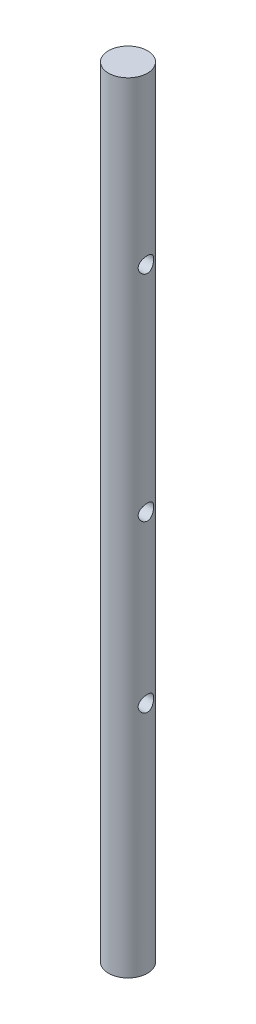
ISO-10303-21;
HEADER;
FILE_DESCRIPTION(('STEP AP214'),'2;1');
FILE_NAME('part.step','',(''),(''),'','','');
FILE_SCHEMA(('AUTOMOTIVE_DESIGN { 1 0 10303 214 1 1 1 1 }'));
ENDSEC;
DATA;
#1=APPLICATION_CONTEXT('core data for automotive mechanical design processes');
#2=APPLICATION_PROTOCOL_DEFINITION('international standard','automotive_design',2000,#1);
#3=PRODUCT_CONTEXT('',#1,'mechanical');
#4=PRODUCT('Part','Part','',(#3));
#5=PRODUCT_RELATED_PRODUCT_CATEGORY('part','',(#4));
#6=PRODUCT_DEFINITION_FORMATION('','',#4);
#7=PRODUCT_DEFINITION_CONTEXT('part definition',#1,'design');
#8=PRODUCT_DEFINITION('design','',#6,#7);
#9=PRODUCT_DEFINITION_SHAPE('','',#8);
#10=(LENGTH_UNIT() NAMED_UNIT(*) SI_UNIT(.MILLI.,.METRE.));
#11=(NAMED_UNIT(*) PLANE_ANGLE_UNIT() SI_UNIT($,.RADIAN.));
#12=(NAMED_UNIT(*) SI_UNIT($,.STERADIAN.) SOLID_ANGLE_UNIT());
#13=UNCERTAINTY_MEASURE_WITH_UNIT(LENGTH_MEASURE(1.E-05),#10,'distance_accuracy_value','');
#14=(GEOMETRIC_REPRESENTATION_CONTEXT(3) GLOBAL_UNCERTAINTY_ASSIGNED_CONTEXT((#13)) GLOBAL_UNIT_ASSIGNED_CONTEXT((#10,
#11,#12)) REPRESENTATION_CONTEXT('',''));
#15=CARTESIAN_POINT('',(0.,0.,0.));
#16=DIRECTION('',(0.,0.,1.));
#17=DIRECTION('',(1.,0.,0.));
#18=AXIS2_PLACEMENT_3D('',#15,#16,#17);
#19=CARTESIAN_POINT('',(0.,40.,0.));
#20=DIRECTION('',(0.,-1.,0.));
#21=DIRECTION('',(0.,0.,-1.));
#22=AXIS2_PLACEMENT_3D('',#19,#20,#21);
#23=CYLINDRICAL_SURFACE('',#22,2.);
#24=CARTESIAN_POINT('',(-1.83574533568794,-15.9999999999999,-0.793749999999993));
#25=CARTESIAN_POINT('',(-1.83574955054247,-15.9574484641707,-0.793745396301787));
#26=CARTESIAN_POINT('',(-1.83724567997836,-15.914835025832,-0.790308000142732));
#27=CARTESIAN_POINT('',(-1.84304379579147,-15.8308287130867,-0.776685731636039));
#28=CARTESIAN_POINT('',(-1.84735301917327,-15.7894392754298,-0.766483454794609));
#29=CARTESIAN_POINT('',(-1.85820609703918,-15.7092378458049,-0.739780682359105));
#30=CARTESIAN_POINT('',(-1.86474160512701,-15.6704168646051,-0.723303684027096));
#31=CARTESIAN_POINT('',(-1.87929924018793,-15.5960995989641,-0.684587700670641));
#32=CARTESIAN_POINT('',(-1.88732102526627,-15.5606025527249,-0.66235004032882));
#33=CARTESIAN_POINT('',(-1.90445306254819,-15.491921939935,-0.611404607877717));
#34=CARTESIAN_POINT('',(-1.91359797135974,-15.458948896379,-0.58242455320319));
#35=CARTESIAN_POINT('',(-1.93165936134538,-15.3981774422812,-0.519390333561787));
#36=CARTESIAN_POINT('',(-1.94057576241782,-15.3703808254656,-0.485334417048486));
#37=CARTESIAN_POINT('',(-1.95759051200044,-15.3197117508262,-0.411494211014499));
#38=CARTESIAN_POINT('',(-1.96564381830241,-15.2970716273891,-0.371539178053825));
#39=CARTESIAN_POINT('',(-1.97960568485495,-15.2589235628622,-0.288010942260691));
#40=CARTESIAN_POINT('',(-1.98551510480408,-15.2434127622461,-0.244439198361519));
#41=CARTESIAN_POINT('',(-1.994278096342,-15.2207127549989,-0.157121125661687));
#42=CARTESIAN_POINT('',(-1.99726409034064,-15.2131616141388,-0.11348244391469));
#43=CARTESIAN_POINT('',(-2.00032198572337,-15.2054305685026,-0.0254620285282214));
#44=CARTESIAN_POINT('',(-2.00039495642489,-15.2052479588735,0.0189194264676442));
#45=CARTESIAN_POINT('',(-1.99769963645173,-15.2120591423197,0.104552158565124));
#46=CARTESIAN_POINT('',(-1.99508827426674,-15.2186565632733,0.14584079325567));
#47=CARTESIAN_POINT('',(-1.98752850107357,-15.2381672870216,0.226669100655476));
#48=CARTESIAN_POINT('',(-1.98257991880232,-15.2510810526577,0.26620864496544));
#49=CARTESIAN_POINT('',(-1.97073664770769,-15.2830171254289,0.343125832511271));
#50=CARTESIAN_POINT('',(-1.96381384179653,-15.3021282789574,0.380462078321979));
#51=CARTESIAN_POINT('',(-1.94871088205107,-15.3458340129062,0.451493621649775));
#52=CARTESIAN_POINT('',(-1.94053030046886,-15.3704304600674,0.48518767385542));
#53=CARTESIAN_POINT('',(-1.92311843114675,-15.4262655701642,0.550294343512175));
#54=CARTESIAN_POINT('',(-1.91385340781356,-15.4578312066733,0.58141795010705));
#55=CARTESIAN_POINT('',(-1.89572727665502,-15.5257725909393,0.638047100725501));
#56=CARTESIAN_POINT('',(-1.88686629759576,-15.5621498579196,0.663550863531981));
#57=CARTESIAN_POINT('',(-1.87032419901317,-15.6399544316078,0.708863105539234));
#58=CARTESIAN_POINT('',(-1.86268211597722,-15.681492901281,0.728496148845984));
#59=CARTESIAN_POINT('',(-1.84989983834642,-15.7676704453951,0.760374307325914));
#60=CARTESIAN_POINT('',(-1.84475804920836,-15.8123075229083,0.772624132286879));
#61=CARTESIAN_POINT('',(-1.83794414914909,-15.9005352392242,0.788690933678145));
#62=CARTESIAN_POINT('',(-1.83608132636498,-15.9440263901334,0.792972324086437));
#63=CARTESIAN_POINT('',(-1.83549335630922,-16.0311361037071,0.794333364515734));
#64=CARTESIAN_POINT('',(-1.83676728049773,-16.0747546248497,0.791415145764527));
#65=CARTESIAN_POINT('',(-1.84211379225481,-16.1583276832494,0.778882445152772));
#66=CARTESIAN_POINT('',(-1.84602654712882,-16.1983509804937,0.76964998649291));
#67=CARTESIAN_POINT('',(-1.8560126925925,-16.2762549417427,0.745244554049858));
#68=CARTESIAN_POINT('',(-1.86208655756813,-16.3141351331959,0.730070275902407));
#69=CARTESIAN_POINT('',(-1.8760094490388,-16.3883748212218,0.693530338384259));
#70=CARTESIAN_POINT('',(-1.88392001116966,-16.4246120063183,0.671940347321197));
#71=CARTESIAN_POINT('',(-1.90052993664314,-16.493112167528,0.62341234280231));
#72=CARTESIAN_POINT('',(-1.90922961650422,-16.5253735365779,0.596472178170032));
#73=CARTESIAN_POINT('',(-1.92719923514798,-16.5874368928383,0.535701976570249));
#74=CARTESIAN_POINT('',(-1.93646478919637,-16.6168909926408,0.501514024585907));
#75=CARTESIAN_POINT('',(-1.95392735928662,-16.6696964777956,0.428458518504622));
#76=CARTESIAN_POINT('',(-1.96212433755802,-16.6930476474596,0.389590799087355));
#77=CARTESIAN_POINT('',(-1.97654765183198,-16.7328882868587,0.308164862923358));
#78=CARTESIAN_POINT('',(-1.98277537108028,-16.749382575574,0.265609263504555));
#79=CARTESIAN_POINT('',(-1.99254765820735,-16.7748711548716,0.178019881177012));
#80=CARTESIAN_POINT('',(-1.99609365688725,-16.7838694451181,0.132987433540315));
#81=CARTESIAN_POINT('',(-1.99995222373459,-16.7936409758111,0.0448486948475377));
#82=CARTESIAN_POINT('',(-2.00045823500524,-16.7949063783654,0.00180500892137128));
#83=CARTESIAN_POINT('',(-1.99870005498365,-16.790471582344,-0.0838596973965634));
#84=CARTESIAN_POINT('',(-1.99643627178576,-16.7847724099108,-0.126480779121098));
#85=CARTESIAN_POINT('',(-1.98948862254071,-16.7669213899222,-0.208786505249207));
#86=CARTESIAN_POINT('',(-1.98487907797685,-16.7549674054179,-0.248520835895962));
#87=CARTESIAN_POINT('',(-1.97373163185118,-16.7251525226997,-0.325414046077396));
#88=CARTESIAN_POINT('',(-1.96719337199144,-16.7072905268781,-0.362572445495235));
#89=CARTESIAN_POINT('',(-1.95247434043231,-16.6652807458812,-0.43505379922015));
#90=CARTESIAN_POINT('',(-1.94423399280796,-16.640891128128,-0.470224229941565));
#91=CARTESIAN_POINT('',(-1.92710578577927,-16.5868824383784,-0.536119806851737));
#92=CARTESIAN_POINT('',(-1.9182176652095,-16.5572612502197,-0.566843145013115));
#93=CARTESIAN_POINT('',(-1.90012595565144,-16.4915035582623,-0.624901494634382));
#94=CARTESIAN_POINT('',(-1.89093599240793,-16.4550806125859,-0.651917387975951));
#95=CARTESIAN_POINT('',(-1.87386670073336,-16.377923328667,-0.699474739933922));
#96=CARTESIAN_POINT('',(-1.86598753485959,-16.3371884567085,-0.720015395812111));
#97=CARTESIAN_POINT('',(-1.85315134716856,-16.2562455103246,-0.752400473276935));
#98=CARTESIAN_POINT('',(-1.84799680147857,-16.2163126103519,-0.76485570592469));
#99=CARTESIAN_POINT('',(-1.84024600746584,-16.1348160503051,-0.783325471994174));
#100=CARTESIAN_POINT('',(-1.8376425956624,-16.0932572992531,-0.789358044135553));
#101=CARTESIAN_POINT('',(-1.83598526376804,-16.0343594102847,-0.793193827235275));
#102=CARTESIAN_POINT('',(-1.83574363348767,-16.0171847533171,-0.793751859237656));
#103=CARTESIAN_POINT('',(-1.83574533568794,-15.9999999999999,-0.793749999999993));
#104=B_SPLINE_CURVE_WITH_KNOTS('',3,(#24,#25,#26,#27,#28,#29,#30,#31,#32,#33,#34,#35,#36,#37,
#38,#39,#40,#41,#42,#43,#44,#45,#46,#47,#48,#49,#50,#51,#52,#53,#54,#55,#56,#57,#58,#59,#60,#61,
#62,#63,#64,#65,#66,#67,#68,#69,#70,#71,#72,#73,#74,#75,#76,#77,#78,#79,#80,#81,#82,#83,#84,#85,
#86,#87,#88,#89,#90,#91,#92,#93,#94,#95,#96,#97,#98,#99,#100,#101,#102,#103),.UNSPECIFIED.,.T.,
.F.,(4,2,2,2,2,2,2,2,2,2,2,2,2,2,2,2,2,2,2,2,2,2,2,2,2,2,2,2,2,2,2,2,2,2,2,2,2,2,2,4),(0.,
0.12760182890938,0.255533228631468,0.382990194633451,0.510417877476071,0.644348831549181,
0.778326109134045,0.917490933808576,1.05659989153603,1.18906754123694,1.32148656404579,
1.44658141804116,1.57168543995982,1.69866873096893,1.82569530272758,1.96094729493137,
2.09624209397259,2.23524850818157,2.37416615547279,2.5046979866336,2.63519118240762,
2.75841613761499,2.88166815867613,3.0098739294196,3.13813135337581,3.27568759158295,
3.41324869061239,3.55071294830512,3.68810381168247,3.81665082440961,3.94517889963325,
4.06986714598288,4.19457857030375,4.32477302972482,4.45502027372795,4.59317804170808,
4.73135293044187,4.85724262104053,4.98277779680822,5.03431074173967),.UNSPECIFIED.);
#105=CARTESIAN_POINT('',(-1.83574533568794,-15.9999999999999,-0.793749999999993));
#106=VERTEX_POINT('',#105);
#107=EDGE_CURVE('E37',#106,#106,#104,.T.);
#108=ORIENTED_EDGE('',*,*,#107,.T.);
#109=EDGE_LOOP('',(#108));
#110=FACE_BOUND('',#109,.T.);
#111=CARTESIAN_POINT('',(1.83574533568794,-15.9999999999999,-0.793749999999993));
#112=CARTESIAN_POINT('',(1.83574955054247,-16.0425515358291,-0.793745396301787));
#113=CARTESIAN_POINT('',(1.83724567997836,-16.0851649741678,-0.790308000142732));
#114=CARTESIAN_POINT('',(1.84304379579147,-16.1691712869131,-0.776685731636039));
#115=CARTESIAN_POINT('',(1.84735301917327,-16.21056072457,-0.766483454794609));
#116=CARTESIAN_POINT('',(1.85820609703918,-16.2907621541949,-0.739780682359107));
#117=CARTESIAN_POINT('',(1.86474160512701,-16.3295831353947,-0.723303684027098));
#118=CARTESIAN_POINT('',(1.87929924018793,-16.4039004010357,-0.684587700670644));
#119=CARTESIAN_POINT('',(1.88732102526627,-16.4393974472748,-0.662350040328823));
#120=CARTESIAN_POINT('',(1.90445306254819,-16.5080780600648,-0.611404607877719));
#121=CARTESIAN_POINT('',(1.91359797135974,-16.5410511036208,-0.582424553203192));
#122=CARTESIAN_POINT('',(1.93165936134538,-16.6018225577186,-0.51939033356179));
#123=CARTESIAN_POINT('',(1.94057576241782,-16.6296191745341,-0.485334417048491));
#124=CARTESIAN_POINT('',(1.95759051200044,-16.6802882491736,-0.411494211014504));
#125=CARTESIAN_POINT('',(1.96564381830241,-16.7029283726107,-0.37153917805383));
#126=CARTESIAN_POINT('',(1.97960568485495,-16.7410764371375,-0.288010942260696));
#127=CARTESIAN_POINT('',(1.98551510480408,-16.7565872377537,-0.244439198361524));
#128=CARTESIAN_POINT('',(1.994278096342,-16.7792872450009,-0.157121125661691));
#129=CARTESIAN_POINT('',(1.99726409034064,-16.7868383858609,-0.113482443914694));
#130=CARTESIAN_POINT('',(2.00032198572337,-16.7945694314972,-0.0254620285282259));
#131=CARTESIAN_POINT('',(2.00039495642489,-16.7947520411263,0.0189194264676396));
#132=CARTESIAN_POINT('',(1.99769963645173,-16.7879408576801,0.104552158565119));
#133=CARTESIAN_POINT('',(1.99508827426674,-16.7813434367265,0.145840793255666));
#134=CARTESIAN_POINT('',(1.98752850107357,-16.7618327129782,0.226669100655471));
#135=CARTESIAN_POINT('',(1.98257991880232,-16.748918947342,0.266208644965436));
#136=CARTESIAN_POINT('',(1.97073664770769,-16.7169828745708,0.343125832511266));
#137=CARTESIAN_POINT('',(1.96381384179653,-16.6978717210424,0.380462078321974));
#138=CARTESIAN_POINT('',(1.94871088205107,-16.6541659870936,0.451493621649771));
#139=CARTESIAN_POINT('',(1.94053030046886,-16.6295695399324,0.485187673855416));
#140=CARTESIAN_POINT('',(1.92311843114676,-16.5737344298356,0.550294343512171));
#141=CARTESIAN_POINT('',(1.91385340781356,-16.5421687933264,0.581417950107045));
#142=CARTESIAN_POINT('',(1.89572727665502,-16.4742274090604,0.638047100725497));
#143=CARTESIAN_POINT('',(1.88686629759576,-16.4378501420802,0.663550863531978));
#144=CARTESIAN_POINT('',(1.87032419901317,-16.360045568392,0.708863105539232));
#145=CARTESIAN_POINT('',(1.86268211597722,-16.3185070987187,0.728496148845982));
#146=CARTESIAN_POINT('',(1.84989983834642,-16.2323295546047,0.760374307325912));
#147=CARTESIAN_POINT('',(1.84475804920836,-16.1876924770915,0.772624132286878));
#148=CARTESIAN_POINT('',(1.83794414914909,-16.0994647607755,0.788690933678144));
#149=CARTESIAN_POINT('',(1.83608132636498,-16.0559736098664,0.792972324086437));
#150=CARTESIAN_POINT('',(1.83549335630922,-15.9688638962927,0.794333364515735));
#151=CARTESIAN_POINT('',(1.83676728049773,-15.9252453751501,0.791415145764527));
#152=CARTESIAN_POINT('',(1.84211379225481,-15.8416723167503,0.778882445152773));
#153=CARTESIAN_POINT('',(1.84602654712881,-15.8016490195061,0.769649986492911));
#154=CARTESIAN_POINT('',(1.85601269259249,-15.7237450582571,0.74524455404986));
#155=CARTESIAN_POINT('',(1.86208655756813,-15.6858648668038,0.730070275902409));
#156=CARTESIAN_POINT('',(1.8760094490388,-15.611625178778,0.69353033838426));
#157=CARTESIAN_POINT('',(1.88392001116966,-15.5753879936815,0.671940347321198));
#158=CARTESIAN_POINT('',(1.90052993664314,-15.5068878324718,0.62341234280231));
#159=CARTESIAN_POINT('',(1.90922961650422,-15.4746264634219,0.596472178170032));
#160=CARTESIAN_POINT('',(1.92719923514798,-15.4125631071615,0.53570197657025));
#161=CARTESIAN_POINT('',(1.93646478919637,-15.383109007359,0.501514024585909));
#162=CARTESIAN_POINT('',(1.95392735928662,-15.3303035222042,0.428458518504626));
#163=CARTESIAN_POINT('',(1.96212433755802,-15.3069523525401,0.389590799087359));
#164=CARTESIAN_POINT('',(1.97654765183198,-15.267111713141,0.308164862923364));
#165=CARTESIAN_POINT('',(1.98277537108028,-15.2506174244257,0.26560926350456));
#166=CARTESIAN_POINT('',(1.99254765820735,-15.2251288451282,0.178019881177017));
#167=CARTESIAN_POINT('',(1.99609365688725,-15.2161305548817,0.13298743354032));
#168=CARTESIAN_POINT('',(1.99995222373459,-15.2063590241886,0.0448486948475424));
#169=CARTESIAN_POINT('',(2.00045823500524,-15.2050936216344,0.00180500892137606));
#170=CARTESIAN_POINT('',(1.99870005498365,-15.2095284176558,-0.0838596973965586));
#171=CARTESIAN_POINT('',(1.99643627178576,-15.2152275900889,-0.126480779121093));
#172=CARTESIAN_POINT('',(1.98948862254071,-15.2330786100776,-0.208786505249202));
#173=CARTESIAN_POINT('',(1.98487907797685,-15.2450325945818,-0.248520835895957));
#174=CARTESIAN_POINT('',(1.97373163185119,-15.2748474773001,-0.325414046077391));
#175=CARTESIAN_POINT('',(1.96719337199144,-15.2927094731217,-0.362572445495231));
#176=CARTESIAN_POINT('',(1.95247434043231,-15.3347192541185,-0.435053799220146));
#177=CARTESIAN_POINT('',(1.94423399280796,-15.3591088718717,-0.470224229941561));
#178=CARTESIAN_POINT('',(1.92710578577927,-15.4131175616213,-0.536119806851733));
#179=CARTESIAN_POINT('',(1.9182176652095,-15.4427387497801,-0.566843145013111));
#180=CARTESIAN_POINT('',(1.90012595565144,-15.5084964417375,-0.624901494634378));
#181=CARTESIAN_POINT('',(1.89093599240793,-15.5449193874138,-0.651917387975948));
#182=CARTESIAN_POINT('',(1.87386670073336,-15.6220766713327,-0.699474739933919));
#183=CARTESIAN_POINT('',(1.86598753485959,-15.6628115432913,-0.720015395812108));
#184=CARTESIAN_POINT('',(1.85315134716856,-15.7437544896752,-0.752400473276933));
#185=CARTESIAN_POINT('',(1.84799680147857,-15.7836873896479,-0.764855705924687));
#186=CARTESIAN_POINT('',(1.84024600746584,-15.8651839496946,-0.783325471994173));
#187=CARTESIAN_POINT('',(1.8376425956624,-15.9067427007466,-0.789358044135553));
#188=CARTESIAN_POINT('',(1.83598526376804,-15.965640589715,-0.793193827235275));
#189=CARTESIAN_POINT('',(1.83574363348767,-15.9828152466827,-0.793751859237656));
#190=CARTESIAN_POINT('',(1.83574533568794,-15.9999999999999,-0.793749999999993));
#191=B_SPLINE_CURVE_WITH_KNOTS('',3,(#111,#112,#113,#114,#115,#116,#117,#118,#119,#120,#121,
#122,#123,#124,#125,#126,#127,#128,#129,#130,#131,#132,#133,#134,#135,#136,#137,#138,#139,#140,
#141,#142,#143,#144,#145,#146,#147,#148,#149,#150,#151,#152,#153,#154,#155,#156,#157,#158,#159,
#160,#161,#162,#163,#164,#165,#166,#167,#168,#169,#170,#171,#172,#173,#174,#175,#176,#177,#178,
#179,#180,#181,#182,#183,#184,#185,#186,#187,#188,#189,#190),.UNSPECIFIED.,.T.,.F.,(4,2,2,2,2,2,
2,2,2,2,2,2,2,2,2,2,2,2,2,2,2,2,2,2,2,2,2,2,2,2,2,2,2,2,2,2,2,2,2,4),(0.,0.12760182890938,
0.255533228631464,0.382990194633443,0.510417877476066,0.644348831549179,0.778326109134038,
0.91749093380857,1.05659989153603,1.18906754123693,1.32148656404579,1.44658141804116,
1.57168543995981,1.69866873096893,1.82569530272757,1.96094729493137,2.09624209397259,
2.23524850818156,2.37416615547278,2.50469798663359,2.63519118240762,2.75841613761499,
2.88166815867613,3.0098739294196,3.13813135337581,3.27568759158295,3.41324869061239,
3.55071294830511,3.68810381168247,3.81665082440961,3.94517889963325,4.06986714598288,
4.19457857030375,4.32477302972481,4.45502027372795,4.59317804170808,4.73135293044186,
4.85724262104053,4.98277779680822,5.03431074173967),.UNSPECIFIED.);
#192=CARTESIAN_POINT('',(1.83574533568794,-15.9999999999999,-0.793749999999993));
#193=VERTEX_POINT('',#192);
#194=EDGE_CURVE('E89',#193,#193,#191,.T.);
#195=ORIENTED_EDGE('',*,*,#194,.T.);
#196=EDGE_LOOP('',(#195));
#197=FACE_BOUND('',#196,.T.);
#198=CARTESIAN_POINT('',(-1.83574533568793,23.,-0.793750000000015));
#199=CARTESIAN_POINT('',(-1.83574955054246,23.0425515358292,-0.793745396301809));
#200=CARTESIAN_POINT('',(-1.83724567997835,23.0851649741679,-0.790308000142755));
#201=CARTESIAN_POINT('',(-1.84304379579146,23.1691712869132,-0.776685731636061));
#202=CARTESIAN_POINT('',(-1.84735301917326,23.2105607245701,-0.76648345479463));
#203=CARTESIAN_POINT('',(-1.85820609703917,23.290762154195,-0.739780682359125));
#204=CARTESIAN_POINT('',(-1.86474160512701,23.3295831353948,-0.723303684027115));
#205=CARTESIAN_POINT('',(-1.87929924018793,23.4039004010358,-0.684587700670657));
#206=CARTESIAN_POINT('',(-1.88732102526626,23.439397447275,-0.662350040328835));
#207=CARTESIAN_POINT('',(-1.90445306254819,23.508078060065,-0.611404607877727));
#208=CARTESIAN_POINT('',(-1.91359797135974,23.5410511036209,-0.582424553203198));
#209=CARTESIAN_POINT('',(-1.93165936134538,23.6018225577187,-0.519390333561793));
#210=CARTESIAN_POINT('',(-1.94057576241782,23.6296191745343,-0.485334417048491));
#211=CARTESIAN_POINT('',(-1.95759051200044,23.6802882491737,-0.4114942110145));
#212=CARTESIAN_POINT('',(-1.96564381830241,23.7029283726108,-0.371539178053823));
#213=CARTESIAN_POINT('',(-1.97960568485495,23.7410764371377,-0.288010942260683));
#214=CARTESIAN_POINT('',(-1.98551510480408,23.7565872377539,-0.244439198361509));
#215=CARTESIAN_POINT('',(-1.994278096342,23.779287245001,-0.157121125661671));
#216=CARTESIAN_POINT('',(-1.99726409034064,23.7868383858611,-0.113482443914671));
#217=CARTESIAN_POINT('',(-2.00032198572337,23.7945694314973,-0.0254620285281976));
#218=CARTESIAN_POINT('',(-2.00039495642489,23.7947520411265,0.0189194264676705));
#219=CARTESIAN_POINT('',(-1.99769963645173,23.7879408576803,0.104552158565156));
#220=CARTESIAN_POINT('',(-1.99508827426674,23.7813434367267,0.145840793255705));
#221=CARTESIAN_POINT('',(-1.98752850107357,23.7618327129784,0.226669100655515));
#222=CARTESIAN_POINT('',(-1.98257991880231,23.7489189473422,0.266208644965481));
#223=CARTESIAN_POINT('',(-1.97073664770768,23.716982874571,0.343125832511315));
#224=CARTESIAN_POINT('',(-1.96381384179652,23.6978717210425,0.380462078322025));
#225=CARTESIAN_POINT('',(-1.94871088205106,23.6541659870938,0.451493621649826));
#226=CARTESIAN_POINT('',(-1.94053030046885,23.6295695399326,0.485187673855474));
#227=CARTESIAN_POINT('',(-1.92311843114674,23.5737344298358,0.550294343512234));
#228=CARTESIAN_POINT('',(-1.91385340781354,23.5421687933266,0.581417950107111));
#229=CARTESIAN_POINT('',(-1.895727276655,23.4742274090606,0.638047100725567));
#230=CARTESIAN_POINT('',(-1.88686629759574,23.4378501420803,0.663550863532049));
#231=CARTESIAN_POINT('',(-1.87032419901314,23.3600455683921,0.708863105539305));
#232=CARTESIAN_POINT('',(-1.86268211597719,23.3185070987189,0.728496148846057));
#233=CARTESIAN_POINT('',(-1.84989983834639,23.2323295546048,0.760374307325991));
#234=CARTESIAN_POINT('',(-1.84475804920832,23.1876924770916,0.772624132286957));
#235=CARTESIAN_POINT('',(-1.83794414914906,23.0994647607757,0.788690933678225));
#236=CARTESIAN_POINT('',(-1.83608132636495,23.0559736098665,0.792972324086518));
#237=CARTESIAN_POINT('',(-1.83549335630918,22.9688638962928,0.794333364515816));
#238=CARTESIAN_POINT('',(-1.8367672804977,22.9252453751502,0.791415145764609));
#239=CARTESIAN_POINT('',(-1.84211379225477,22.8416723167504,0.778882445152855));
#240=CARTESIAN_POINT('',(-1.84602654712878,22.8016490195062,0.769649986492993));
#241=CARTESIAN_POINT('',(-1.85601269259246,22.7237450582572,0.745244554049941));
#242=CARTESIAN_POINT('',(-1.8620865575681,22.6858648668039,0.73007027590249));
#243=CARTESIAN_POINT('',(-1.87600944903877,22.6116251787781,0.693530338384341));
#244=CARTESIAN_POINT('',(-1.88392001116963,22.5753879936816,0.671940347321278));
#245=CARTESIAN_POINT('',(-1.90052993664311,22.5068878324719,0.62341234280239));
#246=CARTESIAN_POINT('',(-1.90922961650419,22.474626463422,0.596472178170111));
#247=CARTESIAN_POINT('',(-1.92719923514796,22.4125631071616,0.535701976570325));
#248=CARTESIAN_POINT('',(-1.93646478919635,22.3831090073591,0.501514024585982));
#249=CARTESIAN_POINT('',(-1.95392735928661,22.3303035222043,0.428458518504694));
#250=CARTESIAN_POINT('',(-1.962124337558,22.3069523525402,0.389590799087426));
#251=CARTESIAN_POINT('',(-1.97654765183197,22.2671117131411,0.308164862923425));
#252=CARTESIAN_POINT('',(-1.98277537108027,22.2506174244258,0.265609263504617));
#253=CARTESIAN_POINT('',(-1.99254765820734,22.2251288451283,0.178019881177067));
#254=CARTESIAN_POINT('',(-1.99609365688725,22.2161305548818,0.132987433540367));
#255=CARTESIAN_POINT('',(-1.99995222373459,22.2063590241887,0.044848694847583));
#256=CARTESIAN_POINT('',(-2.00045823500524,22.2050936216344,0.00180500892141387));
#257=CARTESIAN_POINT('',(-1.99870005498365,22.2095284176559,-0.0838596973965262));
#258=CARTESIAN_POINT('',(-1.99643627178577,22.215227590089,-0.126480779121063));
#259=CARTESIAN_POINT('',(-1.98948862254071,22.2330786100776,-0.208786505249177));
#260=CARTESIAN_POINT('',(-1.98487907797685,22.2450325945819,-0.248520835895934));
#261=CARTESIAN_POINT('',(-1.97373163185119,22.2748474773001,-0.325414046077373));
#262=CARTESIAN_POINT('',(-1.96719337199144,22.2927094731218,-0.362572445495215));
#263=CARTESIAN_POINT('',(-1.95247434043231,22.3347192541186,-0.435053799220136));
#264=CARTESIAN_POINT('',(-1.94423399280796,22.3591088718718,-0.470224229941554));
#265=CARTESIAN_POINT('',(-1.92710578577927,22.4131175616214,-0.53611980685173));
#266=CARTESIAN_POINT('',(-1.9182176652095,22.4427387497802,-0.56684314501311));
#267=CARTESIAN_POINT('',(-1.90012595565144,22.5084964417375,-0.624901494634382));
#268=CARTESIAN_POINT('',(-1.89093599240793,22.5449193874139,-0.651917387975953));
#269=CARTESIAN_POINT('',(-1.87386670073335,22.6220766713328,-0.699474739933929));
#270=CARTESIAN_POINT('',(-1.86598753485959,22.6628115432914,-0.720015395812119));
#271=CARTESIAN_POINT('',(-1.85315134716855,22.7437544896753,-0.752400473276948));
#272=CARTESIAN_POINT('',(-1.84799680147856,22.7836873896479,-0.764855705924703));
#273=CARTESIAN_POINT('',(-1.84024600746583,22.8651839496947,-0.783325471994191));
#274=CARTESIAN_POINT('',(-1.8376425956624,22.9067427007467,-0.789358044135573));
#275=CARTESIAN_POINT('',(-1.83598526376803,22.9656405897151,-0.793193827235297));
#276=CARTESIAN_POINT('',(-1.83574363348766,22.9828152466828,-0.793751859237678));
#277=CARTESIAN_POINT('',(-1.83574533568793,23.,-0.793750000000015));
#278=B_SPLINE_CURVE_WITH_KNOTS('',3,(#198,#199,#200,#201,#202,#203,#204,#205,#206,#207,#208,
#209,#210,#211,#212,#213,#214,#215,#216,#217,#218,#219,#220,#221,#222,#223,#224,#225,#226,#227,
#228,#229,#230,#231,#232,#233,#234,#235,#236,#237,#238,#239,#240,#241,#242,#243,#244,#245,#246,
#247,#248,#249,#250,#251,#252,#253,#254,#255,#256,#257,#258,#259,#260,#261,#262,#263,#264,#265,
#266,#267,#268,#269,#270,#271,#272,#273,#274,#275,#276,#277),.UNSPECIFIED.,.T.,.F.,(4,2,2,2,2,2,
2,2,2,2,2,2,2,2,2,2,2,2,2,2,2,2,2,2,2,2,2,2,2,2,2,2,2,2,2,2,2,2,2,4),(0.,0.127601828909387,
0.255533228631482,0.382990194633473,0.510417877476105,0.644348831549223,0.778326109134093,
0.917490933808632,1.0565998915361,1.18906754123701,1.32148656404588,1.44658141804125,
1.57168543995991,1.69866873096904,1.82569530272769,1.96094729493149,2.09624209397272,
2.23524850818171,2.37416615547294,2.50469798663376,2.63519118240779,2.75841613761516,
2.88166815867631,3.00987392941978,3.138131353376,3.27568759158316,3.41324869061261,
3.55071294830534,3.68810381168271,3.81665082440986,3.94517889963351,4.06986714598314,
4.19457857030402,4.3247730297251,4.45502027372823,4.59317804170838,4.73135293044216,
4.85724262104083,4.98277779680854,5.03431074174001),.UNSPECIFIED.);
#279=CARTESIAN_POINT('',(-1.83574533568793,23.,-0.793750000000015));
#280=VERTEX_POINT('',#279);
#281=EDGE_CURVE('E58',#280,#280,#278,.T.);
#282=ORIENTED_EDGE('',*,*,#281,.T.);
#283=EDGE_LOOP('',(#282));
#284=FACE_BOUND('',#283,.T.);
#285=CARTESIAN_POINT('',(1.83574533568793,23.,-0.793750000000015));
#286=CARTESIAN_POINT('',(1.83574955054246,22.9574484641708,-0.793745396301809));
#287=CARTESIAN_POINT('',(1.83724567997835,22.9148350258321,-0.790308000142755));
#288=CARTESIAN_POINT('',(1.84304379579146,22.8308287130868,-0.776685731636061));
#289=CARTESIAN_POINT('',(1.84735301917326,22.7894392754299,-0.76648345479463));
#290=CARTESIAN_POINT('',(1.85820609703917,22.709237845805,-0.739780682359125));
#291=CARTESIAN_POINT('',(1.86474160512701,22.6704168646052,-0.723303684027115));
#292=CARTESIAN_POINT('',(1.87929924018793,22.5960995989642,-0.684587700670657));
#293=CARTESIAN_POINT('',(1.88732102526626,22.560602552725,-0.662350040328835));
#294=CARTESIAN_POINT('',(1.90445306254819,22.491921939935,-0.611404607877727));
#295=CARTESIAN_POINT('',(1.91359797135974,22.4589488963791,-0.582424553203198));
#296=CARTESIAN_POINT('',(1.93165936134538,22.3981774422813,-0.519390333561793));
#297=CARTESIAN_POINT('',(1.94057576241782,22.3703808254657,-0.485334417048491));
#298=CARTESIAN_POINT('',(1.95759051200044,22.3197117508263,-0.4114942110145));
#299=CARTESIAN_POINT('',(1.96564381830241,22.2970716273892,-0.371539178053823));
#300=CARTESIAN_POINT('',(1.97960568485495,22.2589235628623,-0.288010942260683));
#301=CARTESIAN_POINT('',(1.98551510480408,22.2434127622461,-0.244439198361509));
#302=CARTESIAN_POINT('',(1.994278096342,22.220712754999,-0.157121125661671));
#303=CARTESIAN_POINT('',(1.99726409034064,22.2131616141389,-0.113482443914671));
#304=CARTESIAN_POINT('',(2.00032198572337,22.2054305685027,-0.0254620285281976));
#305=CARTESIAN_POINT('',(2.00039495642489,22.2052479588735,0.0189194264676705));
#306=CARTESIAN_POINT('',(1.99769963645173,22.2120591423197,0.104552158565155));
#307=CARTESIAN_POINT('',(1.99508827426674,22.2186565632733,0.145840793255704));
#308=CARTESIAN_POINT('',(1.98752850107357,22.2381672870216,0.226669100655514));
#309=CARTESIAN_POINT('',(1.98257991880231,22.2510810526578,0.266208644965481));
#310=CARTESIAN_POINT('',(1.97073664770768,22.283017125429,0.343125832511315));
#311=CARTESIAN_POINT('',(1.96381384179652,22.3021282789575,0.380462078322025));
#312=CARTESIAN_POINT('',(1.94871088205106,22.3458340129062,0.451493621649826));
#313=CARTESIAN_POINT('',(1.94053030046885,22.3704304600674,0.485187673855474));
#314=CARTESIAN_POINT('',(1.92311843114674,22.4262655701642,0.550294343512234));
#315=CARTESIAN_POINT('',(1.91385340781354,22.4578312066734,0.581417950107111));
#316=CARTESIAN_POINT('',(1.895727276655,22.5257725909394,0.638047100725567));
#317=CARTESIAN_POINT('',(1.88686629759574,22.5621498579197,0.663550863532049));
#318=CARTESIAN_POINT('',(1.87032419901314,22.6399544316079,0.708863105539305));
#319=CARTESIAN_POINT('',(1.86268211597719,22.6814929012811,0.728496148846057));
#320=CARTESIAN_POINT('',(1.84989983834639,22.7676704453952,0.760374307325991));
#321=CARTESIAN_POINT('',(1.84475804920832,22.8123075229084,0.772624132286957));
#322=CARTESIAN_POINT('',(1.83794414914905,22.9005352392243,0.788690933678225));
#323=CARTESIAN_POINT('',(1.83608132636495,22.9440263901335,0.792972324086519));
#324=CARTESIAN_POINT('',(1.83549335630918,23.0311361037072,0.794333364515816));
#325=CARTESIAN_POINT('',(1.8367672804977,23.0747546248498,0.791415145764608));
#326=CARTESIAN_POINT('',(1.84211379225477,23.1583276832496,0.778882445152855));
#327=CARTESIAN_POINT('',(1.84602654712878,23.1983509804938,0.769649986492993));
#328=CARTESIAN_POINT('',(1.85601269259246,23.2762549417428,0.745244554049941));
#329=CARTESIAN_POINT('',(1.8620865575681,23.3141351331961,0.73007027590249));
#330=CARTESIAN_POINT('',(1.87600944903877,23.3883748212219,0.693530338384341));
#331=CARTESIAN_POINT('',(1.88392001116963,23.4246120063184,0.671940347321278));
#332=CARTESIAN_POINT('',(1.90052993664311,23.4931121675281,0.62341234280239));
#333=CARTESIAN_POINT('',(1.90922961650419,23.525373536578,0.596472178170111));
#334=CARTESIAN_POINT('',(1.92719923514796,23.5874368928384,0.535701976570325));
#335=CARTESIAN_POINT('',(1.93646478919635,23.6168909926409,0.501514024585982));
#336=CARTESIAN_POINT('',(1.95392735928661,23.6696964777957,0.428458518504694));
#337=CARTESIAN_POINT('',(1.962124337558,23.6930476474598,0.389590799087426));
#338=CARTESIAN_POINT('',(1.97654765183197,23.7328882868589,0.308164862923425));
#339=CARTESIAN_POINT('',(1.98277537108027,23.7493825755742,0.265609263504617));
#340=CARTESIAN_POINT('',(1.99254765820734,23.7748711548717,0.178019881177067));
#341=CARTESIAN_POINT('',(1.99609365688725,23.7838694451182,0.132987433540367));
#342=CARTESIAN_POINT('',(1.99995222373459,23.7936409758113,0.044848694847583));
#343=CARTESIAN_POINT('',(2.00045823500524,23.7949063783656,0.00180500892141387));
#344=CARTESIAN_POINT('',(1.99870005498365,23.7904715823441,-0.0838596973965262));
#345=CARTESIAN_POINT('',(1.99643627178577,23.784772409911,-0.126480779121063));
#346=CARTESIAN_POINT('',(1.98948862254071,23.7669213899224,-0.208786505249177));
#347=CARTESIAN_POINT('',(1.98487907797685,23.7549674054181,-0.248520835895934));
#348=CARTESIAN_POINT('',(1.97373163185119,23.7251525226999,-0.325414046077373));
#349=CARTESIAN_POINT('',(1.96719337199144,23.7072905268782,-0.362572445495215));
#350=CARTESIAN_POINT('',(1.95247434043231,23.6652807458814,-0.435053799220136));
#351=CARTESIAN_POINT('',(1.94423399280796,23.6408911281282,-0.470224229941554));
#352=CARTESIAN_POINT('',(1.92710578577927,23.5868824383786,-0.53611980685173));
#353=CARTESIAN_POINT('',(1.9182176652095,23.5572612502198,-0.56684314501311));
#354=CARTESIAN_POINT('',(1.90012595565144,23.4915035582625,-0.624901494634382));
#355=CARTESIAN_POINT('',(1.89093599240793,23.4550806125861,-0.651917387975953));
#356=CARTESIAN_POINT('',(1.87386670073335,23.3779233286672,-0.699474739933929));
#357=CARTESIAN_POINT('',(1.86598753485959,23.3371884567086,-0.720015395812119));
#358=CARTESIAN_POINT('',(1.85315134716855,23.2562455103247,-0.752400473276948));
#359=CARTESIAN_POINT('',(1.84799680147856,23.216312610352,-0.764855705924703));
#360=CARTESIAN_POINT('',(1.84024600746583,23.1348160503053,-0.783325471994191));
#361=CARTESIAN_POINT('',(1.8376425956624,23.0932572992533,-0.789358044135573));
#362=CARTESIAN_POINT('',(1.83598526376803,23.0343594102849,-0.793193827235297));
#363=CARTESIAN_POINT('',(1.83574363348766,23.0171847533172,-0.793751859237678));
#364=CARTESIAN_POINT('',(1.83574533568793,23.,-0.793750000000015));
#365=B_SPLINE_CURVE_WITH_KNOTS('',3,(#285,#286,#287,#288,#289,#290,#291,#292,#293,#294,#295,
#296,#297,#298,#299,#300,#301,#302,#303,#304,#305,#306,#307,#308,#309,#310,#311,#312,#313,#314,
#315,#316,#317,#318,#319,#320,#321,#322,#323,#324,#325,#326,#327,#328,#329,#330,#331,#332,#333,
#334,#335,#336,#337,#338,#339,#340,#341,#342,#343,#344,#345,#346,#347,#348,#349,#350,#351,#352,
#353,#354,#355,#356,#357,#358,#359,#360,#361,#362,#363,#364),.UNSPECIFIED.,.T.,.F.,(4,2,2,2,2,2,
2,2,2,2,2,2,2,2,2,2,2,2,2,2,2,2,2,2,2,2,2,2,2,2,2,2,2,2,2,2,2,2,2,4),(0.,0.127601828909387,
0.255533228631482,0.382990194633473,0.510417877476105,0.644348831549223,0.778326109134093,
0.917490933808632,1.0565998915361,1.18906754123701,1.32148656404588,1.44658141804125,
1.57168543995991,1.69866873096904,1.82569530272769,1.96094729493149,2.09624209397272,
2.23524850818171,2.37416615547294,2.50469798663377,2.63519118240779,2.75841613761516,
2.88166815867631,3.00987392941978,3.138131353376,3.27568759158316,3.41324869061261,
3.55071294830534,3.68810381168271,3.81665082440986,3.94517889963351,4.06986714598314,
4.19457857030402,4.3247730297251,4.45502027372823,4.59317804170838,4.73135293044216,
4.85724262104083,4.98277779680854,5.03431074174001),.UNSPECIFIED.);
#366=CARTESIAN_POINT('',(1.83574533568793,23.,-0.793750000000015));
#367=VERTEX_POINT('',#366);
#368=EDGE_CURVE('E96',#367,#367,#365,.T.);
#369=ORIENTED_EDGE('',*,*,#368,.T.);
#370=EDGE_LOOP('',(#369));
#371=FACE_BOUND('',#370,.T.);
#372=CARTESIAN_POINT('',(-1.83574533568793,1.,-0.79375000000001));
#373=CARTESIAN_POINT('',(-1.83574955054246,1.0425515358292,-0.793745396301804));
#374=CARTESIAN_POINT('',(-1.83724567997836,1.08516497416789,-0.790308000142749));
#375=CARTESIAN_POINT('',(-1.84304379579146,1.16917128691323,-0.776685731636056));
#376=CARTESIAN_POINT('',(-1.84735301917326,1.21056072457011,-0.766483454794625));
#377=CARTESIAN_POINT('',(-1.85820609703917,1.29076215419501,-0.739780682359121));
#378=CARTESIAN_POINT('',(-1.86474160512701,1.32958313539478,-0.723303684027112));
#379=CARTESIAN_POINT('',(-1.87929924018793,1.40390040103582,-0.684587700670656));
#380=CARTESIAN_POINT('',(-1.88732102526626,1.43939744727497,-0.662350040328834));
#381=CARTESIAN_POINT('',(-1.90445306254819,1.50807806006493,-0.61140460787773));
#382=CARTESIAN_POINT('',(-1.91359797135973,1.54105110362089,-0.582424553203202));
#383=CARTESIAN_POINT('',(-1.93165936134538,1.60182255771871,-0.519390333561799));
#384=CARTESIAN_POINT('',(-1.94057576241781,1.62961917453427,-0.485334417048498));
#385=CARTESIAN_POINT('',(-1.95759051200044,1.68028824917372,-0.411494211014509));
#386=CARTESIAN_POINT('',(-1.96564381830241,1.7029283726108,-0.371539178053834));
#387=CARTESIAN_POINT('',(-1.97960568485495,1.74107643713766,-0.288010942260697));
#388=CARTESIAN_POINT('',(-1.98551510480408,1.75658723775385,-0.244439198361524));
#389=CARTESIAN_POINT('',(-1.994278096342,1.779287245001,-0.15712112566169));
#390=CARTESIAN_POINT('',(-1.99726409034064,1.78683838586106,-0.113482443914692));
#391=CARTESIAN_POINT('',(-2.00032198572337,1.79456943149731,-0.0254620285282213));
#392=CARTESIAN_POINT('',(-2.00039495642489,1.79475204112642,0.0189194264676454));
#393=CARTESIAN_POINT('',(-1.99769963645173,1.78794085768024,0.104552158565127));
#394=CARTESIAN_POINT('',(-1.99508827426674,1.78134343672665,0.145840793255675));
#395=CARTESIAN_POINT('',(-1.98752850107357,1.76183271297835,0.226669100655482));
#396=CARTESIAN_POINT('',(-1.98257991880232,1.74891894734216,0.266208644965447));
#397=CARTESIAN_POINT('',(-1.97073664770769,1.71698287457097,0.34312583251128));
#398=CARTESIAN_POINT('',(-1.96381384179653,1.69787172104251,0.380462078321989));
#399=CARTESIAN_POINT('',(-1.94871088205107,1.65416598709374,0.451493621649787));
#400=CARTESIAN_POINT('',(-1.94053030046886,1.62956953993253,0.485187673855433));
#401=CARTESIAN_POINT('',(-1.92311843114675,1.57373442983573,0.55029434351219));
#402=CARTESIAN_POINT('',(-1.91385340781356,1.54216879332657,0.581417950107065));
#403=CARTESIAN_POINT('',(-1.89572727665501,1.47422740906057,0.638047100725519));
#404=CARTESIAN_POINT('',(-1.88686629759575,1.43785014208033,0.663550863532));
#405=CARTESIAN_POINT('',(-1.87032419901316,1.36004556839212,0.708863105539254));
#406=CARTESIAN_POINT('',(-1.86268211597721,1.31850709871886,0.728496148846005));
#407=CARTESIAN_POINT('',(-1.84989983834641,1.23232955460483,0.760374307325936));
#408=CARTESIAN_POINT('',(-1.84475804920835,1.18769247709159,0.772624132286902));
#409=CARTESIAN_POINT('',(-1.83794414914908,1.09946476077565,0.788690933678169));
#410=CARTESIAN_POINT('',(-1.83608132636497,1.05597360986654,0.792972324086462));
#411=CARTESIAN_POINT('',(-1.83549335630921,0.968863896292823,0.794333364515759));
#412=CARTESIAN_POINT('',(-1.83676728049772,0.925245375150233,0.791415145764552));
#413=CARTESIAN_POINT('',(-1.8421137922548,0.841672316750448,0.778882445152798));
#414=CARTESIAN_POINT('',(-1.8460265471288,0.801649019506171,0.769649986492936));
#415=CARTESIAN_POINT('',(-1.85601269259248,0.723745058257193,0.745244554049884));
#416=CARTESIAN_POINT('',(-1.86208655756812,0.685864866803954,0.730070275902432));
#417=CARTESIAN_POINT('',(-1.87600944903879,0.611625178778125,0.693530338384283));
#418=CARTESIAN_POINT('',(-1.88392001116965,0.575387993681571,0.671940347321221));
#419=CARTESIAN_POINT('',(-1.90052993664313,0.50688783247189,0.623412342802333));
#420=CARTESIAN_POINT('',(-1.90922961650421,0.474626463422023,0.596472178170054));
#421=CARTESIAN_POINT('',(-1.92719923514797,0.412563107161578,0.53570197657027));
#422=CARTESIAN_POINT('',(-1.93646478919636,0.383109007359105,0.501514024585928));
#423=CARTESIAN_POINT('',(-1.95392735928662,0.330303522204284,0.428458518504643));
#424=CARTESIAN_POINT('',(-1.96212433755801,0.306952352540224,0.389590799087376));
#425=CARTESIAN_POINT('',(-1.97654765183198,0.267111713141146,0.308164862923378));
#426=CARTESIAN_POINT('',(-1.98277537108028,0.250617424425842,0.265609263504573));
#427=CARTESIAN_POINT('',(-1.99254765820735,0.225128845128292,0.178019881177027));
#428=CARTESIAN_POINT('',(-1.99609365688725,0.216130554881799,0.132987433540329));
#429=CARTESIAN_POINT('',(-1.99995222373459,0.206359024188739,0.0448486948475492));
#430=CARTESIAN_POINT('',(-2.00045823500524,0.205093621634452,0.00180500892138177));
#431=CARTESIAN_POINT('',(-1.99870005498365,0.209528417655902,-0.0838596973965549));
#432=CARTESIAN_POINT('',(-1.99643627178576,0.215227590089043,-0.12648077912109));
#433=CARTESIAN_POINT('',(-1.98948862254071,0.23307861007768,-0.208786505249201));
#434=CARTESIAN_POINT('',(-1.98487907797685,0.245032594581926,-0.248520835895956));
#435=CARTESIAN_POINT('',(-1.97373163185118,0.274847477300155,-0.325414046077393));
#436=CARTESIAN_POINT('',(-1.96719337199144,0.292709473121783,-0.362572445495233));
#437=CARTESIAN_POINT('',(-1.95247434043231,0.334719254118619,-0.435053799220151));
#438=CARTESIAN_POINT('',(-1.94423399280796,0.359108871871825,-0.470224229941567));
#439=CARTESIAN_POINT('',(-1.92710578577926,0.413117561621449,-0.53611980685174));
#440=CARTESIAN_POINT('',(-1.9182176652095,0.442738749780188,-0.566843145013119));
#441=CARTESIAN_POINT('',(-1.90012595565144,0.508496441737565,-0.624901494634388));
#442=CARTESIAN_POINT('',(-1.89093599240793,0.544919387413937,-0.651917387975959));
#443=CARTESIAN_POINT('',(-1.87386670073335,0.622076671332836,-0.699474739933931));
#444=CARTESIAN_POINT('',(-1.86598753485959,0.662811543291383,-0.720015395812121));
#445=CARTESIAN_POINT('',(-1.85315134716855,0.743754489675307,-0.752400473276947));
#446=CARTESIAN_POINT('',(-1.84799680147856,0.783687389647974,-0.764855705924702));
#447=CARTESIAN_POINT('',(-1.84024600746583,0.865183949694719,-0.783325471994188));
#448=CARTESIAN_POINT('',(-1.8376425956624,0.906742700746728,-0.789358044135568));
#449=CARTESIAN_POINT('',(-1.83598526376804,0.96564058971514,-0.793193827235291));
#450=CARTESIAN_POINT('',(-1.83574363348767,0.982815246682769,-0.793751859237672));
#451=CARTESIAN_POINT('',(-1.83574533568793,1.,-0.79375000000001));
#452=B_SPLINE_CURVE_WITH_KNOTS('',3,(#372,#373,#374,#375,#376,#377,#378,#379,#380,#381,#382,
#383,#384,#385,#386,#387,#388,#389,#390,#391,#392,#393,#394,#395,#396,#397,#398,#399,#400,#401,
#402,#403,#404,#405,#406,#407,#408,#409,#410,#411,#412,#413,#414,#415,#416,#417,#418,#419,#420,
#421,#422,#423,#424,#425,#426,#427,#428,#429,#430,#431,#432,#433,#434,#435,#436,#437,#438,#439,
#440,#441,#442,#443,#444,#445,#446,#447,#448,#449,#450,#451),.UNSPECIFIED.,.T.,.F.,(4,2,2,2,2,2,
2,2,2,2,2,2,2,2,2,2,2,2,2,2,2,2,2,2,2,2,2,2,2,2,2,2,2,2,2,2,2,2,2,4),(0.,0.127601828909384,
0.255533228631472,0.382990194633457,0.510417877476082,0.644348831549196,0.778326109134062,
0.917490933808596,1.05659989153606,1.18906754123696,1.32148656404583,1.4465814180412,
1.57168543995986,1.69866873096897,1.82569530272762,1.96094729493142,2.09624209397264,
2.23524850818162,2.37416615547285,2.50469798663366,2.63519118240769,2.75841613761505,
2.8816681586762,3.00987392941967,3.13813135337589,3.27568759158303,3.41324869061247,
3.55071294830521,3.68810381168256,3.81665082440971,3.94517889963335,4.06986714598298,
4.19457857030386,4.32477302972493,4.45502027372806,4.5931780417082,4.73135293044198,
4.85724262104065,4.98277779680834,5.0343107417398),.UNSPECIFIED.);
#453=CARTESIAN_POINT('',(-1.83574533568793,1.,-0.79375000000001));
#454=VERTEX_POINT('',#453);
#455=EDGE_CURVE('E49',#454,#454,#452,.T.);
#456=ORIENTED_EDGE('',*,*,#455,.T.);
#457=EDGE_LOOP('',(#456));
#458=FACE_BOUND('',#457,.T.);
#459=CARTESIAN_POINT('',(1.83574533568793,1.,-0.79375000000001));
#460=CARTESIAN_POINT('',(1.83574955054246,0.957448464170796,-0.793745396301804));
#461=CARTESIAN_POINT('',(1.83724567997836,0.91483502583211,-0.790308000142749));
#462=CARTESIAN_POINT('',(1.84304379579146,0.830828713086775,-0.776685731636055));
#463=CARTESIAN_POINT('',(1.84735301917326,0.789439275429887,-0.766483454794625));
#464=CARTESIAN_POINT('',(1.85820609703917,0.709237845804987,-0.739780682359121));
#465=CARTESIAN_POINT('',(1.86474160512701,0.67041686460522,-0.723303684027112));
#466=CARTESIAN_POINT('',(1.87929924018793,0.596099598964178,-0.684587700670656));
#467=CARTESIAN_POINT('',(1.88732102526626,0.560602552725029,-0.662350040328834));
#468=CARTESIAN_POINT('',(1.90445306254819,0.491921939935066,-0.61140460787773));
#469=CARTESIAN_POINT('',(1.91359797135973,0.458948896379107,-0.582424553203202));
#470=CARTESIAN_POINT('',(1.93165936134538,0.398177442281293,-0.519390333561798));
#471=CARTESIAN_POINT('',(1.94057576241781,0.370380825465732,-0.485334417048498));
#472=CARTESIAN_POINT('',(1.95759051200044,0.319711750826282,-0.411494211014509));
#473=CARTESIAN_POINT('',(1.96564381830241,0.297071627389197,-0.371539178053834));
#474=CARTESIAN_POINT('',(1.97960568485495,0.258923562862341,-0.288010942260697));
#475=CARTESIAN_POINT('',(1.98551510480408,0.243412762246151,-0.244439198361524));
#476=CARTESIAN_POINT('',(1.994278096342,0.220712754998997,-0.157121125661689));
#477=CARTESIAN_POINT('',(1.99726409034064,0.213161614138935,-0.113482443914691));
#478=CARTESIAN_POINT('',(2.00032198572337,0.205430568502695,-0.025462028528221));
#479=CARTESIAN_POINT('',(2.00039495642489,0.205247958873575,0.0189194264676456));
#480=CARTESIAN_POINT('',(1.99769963645173,0.212059142319765,0.104552158565128));
#481=CARTESIAN_POINT('',(1.99508827426674,0.218656563273354,0.145840793255675));
#482=CARTESIAN_POINT('',(1.98752850107357,0.238167287021649,0.226669100655482));
#483=CARTESIAN_POINT('',(1.98257991880232,0.251081052657836,0.266208644965448));
#484=CARTESIAN_POINT('',(1.97073664770769,0.283017125429025,0.34312583251128));
#485=CARTESIAN_POINT('',(1.96381384179653,0.302128278957492,0.380462078321989));
#486=CARTESIAN_POINT('',(1.94871088205107,0.345834012906265,0.451493621649788));
#487=CARTESIAN_POINT('',(1.94053030046886,0.370430460067473,0.485187673855433));
#488=CARTESIAN_POINT('',(1.92311843114675,0.42626557016427,0.55029434351219));
#489=CARTESIAN_POINT('',(1.91385340781356,0.457831206673431,0.581417950107066));
#490=CARTESIAN_POINT('',(1.89572727665501,0.525772590939433,0.638047100725519));
#491=CARTESIAN_POINT('',(1.88686629759575,0.562149857919675,0.663550863532));
#492=CARTESIAN_POINT('',(1.87032419901316,0.639954431607879,0.708863105539254));
#493=CARTESIAN_POINT('',(1.86268211597721,0.681492901281144,0.728496148846005));
#494=CARTESIAN_POINT('',(1.84989983834641,0.767670445395166,0.760374307325936));
#495=CARTESIAN_POINT('',(1.84475804920835,0.812307522908412,0.772624132286902));
#496=CARTESIAN_POINT('',(1.83794414914908,0.900535239224354,0.788690933678169));
#497=CARTESIAN_POINT('',(1.83608132636497,0.944026390133465,0.792972324086462));
#498=CARTESIAN_POINT('',(1.83549335630921,1.03113610370718,0.794333364515759));
#499=CARTESIAN_POINT('',(1.83676728049772,1.07475462484977,0.791415145764552));
#500=CARTESIAN_POINT('',(1.8421137922548,1.15832768324955,0.778882445152798));
#501=CARTESIAN_POINT('',(1.8460265471288,1.19835098049383,0.769649986492936));
#502=CARTESIAN_POINT('',(1.85601269259249,1.27625494174281,0.745244554049884));
#503=CARTESIAN_POINT('',(1.86208655756813,1.31413513319605,0.730070275902432));
#504=CARTESIAN_POINT('',(1.87600944903879,1.38837482122188,0.693530338384283));
#505=CARTESIAN_POINT('',(1.88392001116965,1.42461200631843,0.671940347321221));
#506=CARTESIAN_POINT('',(1.90052993664313,1.49311216752811,0.623412342802332));
#507=CARTESIAN_POINT('',(1.90922961650421,1.52537353657798,0.596472178170054));
#508=CARTESIAN_POINT('',(1.92719923514798,1.58743689283842,0.53570197657027));
#509=CARTESIAN_POINT('',(1.93646478919636,1.61689099264089,0.501514024585927));
#510=CARTESIAN_POINT('',(1.95392735928662,1.66969647779572,0.428458518504643));
#511=CARTESIAN_POINT('',(1.96212433755801,1.69304764745978,0.389590799087376));
#512=CARTESIAN_POINT('',(1.97654765183198,1.73288828685885,0.308164862923378));
#513=CARTESIAN_POINT('',(1.98277537108028,1.74938257557416,0.265609263504573));
#514=CARTESIAN_POINT('',(1.99254765820735,1.77487115487171,0.178019881177027));
#515=CARTESIAN_POINT('',(1.99609365688725,1.7838694451182,0.132987433540329));
#516=CARTESIAN_POINT('',(1.99995222373459,1.79364097581126,0.0448486948475487));
#517=CARTESIAN_POINT('',(2.00045823500524,1.79490637836555,0.00180500892138119));
#518=CARTESIAN_POINT('',(1.99870005498365,1.7904715823441,-0.0838596973965554));
#519=CARTESIAN_POINT('',(1.99643627178576,1.78477240991096,-0.126480779121091));
#520=CARTESIAN_POINT('',(1.98948862254071,1.76692138992232,-0.208786505249202));
#521=CARTESIAN_POINT('',(1.98487907797685,1.75496740541807,-0.248520835895957));
#522=CARTESIAN_POINT('',(1.97373163185118,1.72515252269985,-0.325414046077394));
#523=CARTESIAN_POINT('',(1.96719337199144,1.70729052687822,-0.362572445495234));
#524=CARTESIAN_POINT('',(1.95247434043231,1.66528074588138,-0.435053799220152));
#525=CARTESIAN_POINT('',(1.94423399280796,1.64089112812817,-0.470224229941568));
#526=CARTESIAN_POINT('',(1.92710578577926,1.58688243837855,-0.536119806851741));
#527=CARTESIAN_POINT('',(1.9182176652095,1.55726125021981,-0.566843145013119));
#528=CARTESIAN_POINT('',(1.90012595565144,1.49150355826243,-0.624901494634389));
#529=CARTESIAN_POINT('',(1.89093599240793,1.45508061258606,-0.651917387975959));
#530=CARTESIAN_POINT('',(1.87386670073335,1.37792332866716,-0.699474739933932));
#531=CARTESIAN_POINT('',(1.86598753485959,1.33718845670862,-0.720015395812121));
#532=CARTESIAN_POINT('',(1.85315134716855,1.25624551032469,-0.752400473276947));
#533=CARTESIAN_POINT('',(1.84799680147856,1.21631261035203,-0.764855705924702));
#534=CARTESIAN_POINT('',(1.84024600746583,1.13481605030528,-0.783325471994188));
#535=CARTESIAN_POINT('',(1.8376425956624,1.09325729925327,-0.789358044135568));
#536=CARTESIAN_POINT('',(1.83598526376804,1.03435941028486,-0.793193827235291));
#537=CARTESIAN_POINT('',(1.83574363348767,1.01718475331723,-0.793751859237672));
#538=CARTESIAN_POINT('',(1.83574533568793,1.,-0.79375000000001));
#539=B_SPLINE_CURVE_WITH_KNOTS('',3,(#459,#460,#461,#462,#463,#464,#465,#466,#467,#468,#469,
#470,#471,#472,#473,#474,#475,#476,#477,#478,#479,#480,#481,#482,#483,#484,#485,#486,#487,#488,
#489,#490,#491,#492,#493,#494,#495,#496,#497,#498,#499,#500,#501,#502,#503,#504,#505,#506,#507,
#508,#509,#510,#511,#512,#513,#514,#515,#516,#517,#518,#519,#520,#521,#522,#523,#524,#525,#526,
#527,#528,#529,#530,#531,#532,#533,#534,#535,#536,#537,#538),.UNSPECIFIED.,.T.,.F.,(4,2,2,2,2,2,
2,2,2,2,2,2,2,2,2,2,2,2,2,2,2,2,2,2,2,2,2,2,2,2,2,2,2,2,2,2,2,2,2,4),(0.,0.127601828909384,
0.255533228631472,0.382990194633457,0.510417877476082,0.644348831549196,0.778326109134062,
0.917490933808597,1.05659989153606,1.18906754123696,1.32148656404583,1.4465814180412,
1.57168543995986,1.69866873096897,1.82569530272762,1.96094729493142,2.09624209397264,
2.23524850818162,2.37416615547285,2.50469798663366,2.63519118240769,2.75841613761506,
2.8816681586762,3.00987392941967,3.13813135337589,3.27568759158303,3.41324869061248,
3.55071294830521,3.68810381168256,3.81665082440971,3.94517889963335,4.06986714598299,
4.19457857030386,4.32477302972493,4.45502027372806,4.5931780417082,4.73135293044198,
4.85724262104065,4.98277779680835,5.0343107417398),.UNSPECIFIED.);
#540=CARTESIAN_POINT('',(1.83574533568793,1.,-0.79375000000001));
#541=VERTEX_POINT('',#540);
#542=EDGE_CURVE('E52',#541,#541,#539,.T.);
#543=ORIENTED_EDGE('',*,*,#542,.T.);
#544=EDGE_LOOP('',(#543));
#545=FACE_BOUND('',#544,.T.);
#546=CARTESIAN_POINT('',(0.,40.,0.));
#547=DIRECTION('',(0.,1.,0.));
#548=DIRECTION('',(0.,0.,1.));
#549=AXIS2_PLACEMENT_3D('',#546,#547,#548);
#550=CIRCLE('',#549,2.);
#551=CARTESIAN_POINT('',(0.,40.,2.));
#552=VERTEX_POINT('',#551);
#553=EDGE_CURVE('E10',#552,#552,#550,.T.);
#554=ORIENTED_EDGE('',*,*,#553,.F.);
#555=EDGE_LOOP('',(#554));
#556=FACE_BOUND('',#555,.T.);
#557=CARTESIAN_POINT('',(0.,-40.,0.));
#558=DIRECTION('',(0.,1.,0.));
#559=DIRECTION('',(0.,0.,1.));
#560=AXIS2_PLACEMENT_3D('',#557,#558,#559);
#561=CIRCLE('',#560,2.);
#562=CARTESIAN_POINT('',(0.,-40.,2.));
#563=VERTEX_POINT('',#562);
#564=EDGE_CURVE('E44',#563,#563,#561,.T.);
#565=ORIENTED_EDGE('',*,*,#564,.T.);
#566=EDGE_LOOP('',(#565));
#567=FACE_BOUND('',#566,.T.);
#568=ADVANCED_FACE('F33',(#110,#197,#284,#371,#458,#545,#556,#567),#23,.T.);
#569=CARTESIAN_POINT('',(0.,40.,0.));
#570=DIRECTION('',(0.,1.,0.));
#571=DIRECTION('',(0.,0.,1.));
#572=AXIS2_PLACEMENT_3D('',#569,#570,#571);
#573=PLANE('',#572);
#574=ORIENTED_EDGE('',*,*,#553,.T.);
#575=EDGE_LOOP('',(#574));
#576=FACE_BOUND('',#575,.T.);
#577=ADVANCED_FACE('F71',(#576),#573,.T.);
#578=CARTESIAN_POINT('',(0.,-40.,0.));
#579=DIRECTION('',(0.,1.,0.));
#580=DIRECTION('',(0.,0.,1.));
#581=AXIS2_PLACEMENT_3D('',#578,#579,#580);
#582=PLANE('',#581);
#583=ORIENTED_EDGE('',*,*,#564,.F.);
#584=EDGE_LOOP('',(#583));
#585=FACE_BOUND('',#584,.T.);
#586=ADVANCED_FACE('F68',(#585),#582,.F.);
#587=CARTESIAN_POINT('',(-5.,1.,0.));
#588=DIRECTION('',(1.,0.,0.));
#589=DIRECTION('',(0.,0.,-1.));
#590=AXIS2_PLACEMENT_3D('',#587,#588,#589);
#591=CYLINDRICAL_SURFACE('',#590,0.793749999999999);
#592=ORIENTED_EDGE('',*,*,#542,.F.);
#593=EDGE_LOOP('',(#592));
#594=FACE_BOUND('',#593,.T.);
#595=ORIENTED_EDGE('',*,*,#455,.F.);
#596=EDGE_LOOP('',(#595));
#597=FACE_BOUND('',#596,.T.);
#598=ADVANCED_FACE('F62',(#594,#597),#591,.F.);
#599=CARTESIAN_POINT('',(-5.,23.,0.));
#600=DIRECTION('',(1.,0.,0.));
#601=DIRECTION('',(0.,0.,-1.));
#602=AXIS2_PLACEMENT_3D('',#599,#600,#601);
#603=CYLINDRICAL_SURFACE('',#602,0.793750000000031);
#604=ORIENTED_EDGE('',*,*,#368,.F.);
#605=EDGE_LOOP('',(#604));
#606=FACE_BOUND('',#605,.T.);
#607=ORIENTED_EDGE('',*,*,#281,.F.);
#608=EDGE_LOOP('',(#607));
#609=FACE_BOUND('',#608,.T.);
#610=ADVANCED_FACE('F67',(#606,#609),#603,.F.);
#611=CARTESIAN_POINT('',(-5.,-15.9999999999999,0.));
#612=DIRECTION('',(1.,0.,0.));
#613=DIRECTION('',(0.,0.,-1.));
#614=AXIS2_PLACEMENT_3D('',#611,#612,#613);
#615=CYLINDRICAL_SURFACE('',#614,0.793749999999979);
#616=ORIENTED_EDGE('',*,*,#194,.F.);
#617=EDGE_LOOP('',(#616));
#618=FACE_BOUND('',#617,.T.);
#619=ORIENTED_EDGE('',*,*,#107,.F.);
#620=EDGE_LOOP('',(#619));
#621=FACE_BOUND('',#620,.T.);
#622=ADVANCED_FACE('F112',(#618,#621),#615,.F.);
#623=CLOSED_SHELL('',(#568,#577,#586,#598,#610,#622));
#624=MANIFOLD_SOLID_BREP('B2',#623);
#625=ADVANCED_BREP_SHAPE_REPRESENTATION('',(#18,#624),#14);
#626=SHAPE_DEFINITION_REPRESENTATION(#9,#625);
ENDSEC;
END-ISO-10303-21;
